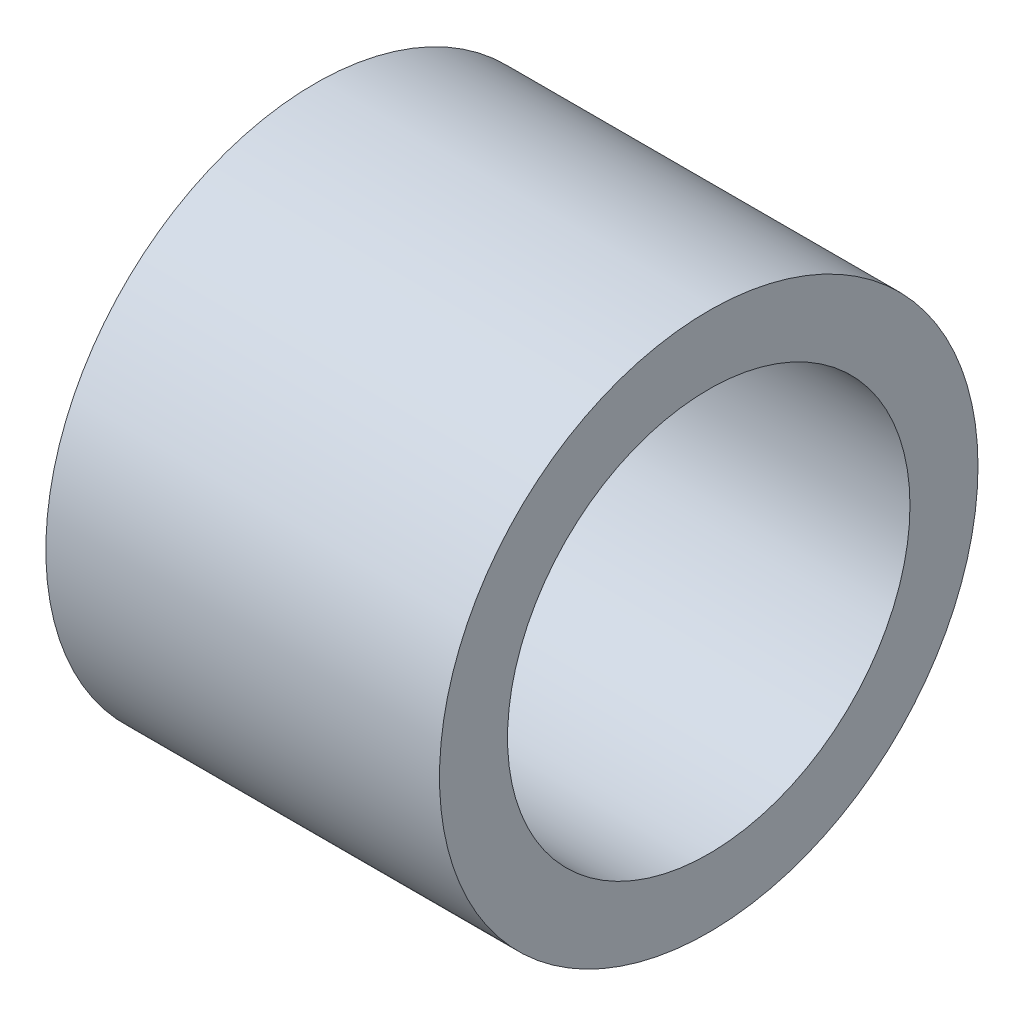
ISO-10303-21;
HEADER;
FILE_DESCRIPTION(('STEP AP214'),'2;1');
FILE_NAME('part.step','',(''),(''),'','','');
FILE_SCHEMA(('AUTOMOTIVE_DESIGN { 1 0 10303 214 1 1 1 1 }'));
ENDSEC;
DATA;
#1=APPLICATION_CONTEXT('core data for automotive mechanical design processes');
#2=APPLICATION_PROTOCOL_DEFINITION('international standard','automotive_design',2000,#1);
#3=PRODUCT_CONTEXT('',#1,'mechanical');
#4=PRODUCT('Part','Part','',(#3));
#5=PRODUCT_RELATED_PRODUCT_CATEGORY('part','',(#4));
#6=PRODUCT_DEFINITION_FORMATION('','',#4);
#7=PRODUCT_DEFINITION_CONTEXT('part definition',#1,'design');
#8=PRODUCT_DEFINITION('design','',#6,#7);
#9=PRODUCT_DEFINITION_SHAPE('','',#8);
#10=(LENGTH_UNIT() NAMED_UNIT(*) SI_UNIT(.MILLI.,.METRE.));
#11=(NAMED_UNIT(*) PLANE_ANGLE_UNIT() SI_UNIT($,.RADIAN.));
#12=(NAMED_UNIT(*) SI_UNIT($,.STERADIAN.) SOLID_ANGLE_UNIT());
#13=UNCERTAINTY_MEASURE_WITH_UNIT(LENGTH_MEASURE(1.E-05),#10,'distance_accuracy_value','');
#14=(GEOMETRIC_REPRESENTATION_CONTEXT(3) GLOBAL_UNCERTAINTY_ASSIGNED_CONTEXT((#13)) GLOBAL_UNIT_ASSIGNED_CONTEXT((#10,
#11,#12)) REPRESENTATION_CONTEXT('',''));
#15=CARTESIAN_POINT('',(0.,0.,0.));
#16=DIRECTION('',(0.,0.,1.));
#17=DIRECTION('',(1.,0.,0.));
#18=AXIS2_PLACEMENT_3D('',#15,#16,#17);
#19=CARTESIAN_POINT('',(0.,0.,0.));
#20=DIRECTION('',(1.,0.,0.));
#21=DIRECTION('',(0.,0.,-1.));
#22=AXIS2_PLACEMENT_3D('',#19,#20,#21);
#23=CYLINDRICAL_SURFACE('',#22,8.1153);
#24=CARTESIAN_POINT('',(15.875,0.,0.));
#25=DIRECTION('',(1.,0.,0.));
#26=DIRECTION('',(0.,0.,-1.));
#27=AXIS2_PLACEMENT_3D('',#24,#25,#26);
#28=CIRCLE('',#27,8.1153);
#29=CARTESIAN_POINT('',(15.875,0.,-8.1153));
#30=VERTEX_POINT('',#29);
#31=EDGE_CURVE('E17',#30,#30,#28,.F.);
#32=ORIENTED_EDGE('',*,*,#31,.F.);
#33=EDGE_LOOP('',(#32));
#34=FACE_BOUND('',#33,.T.);
#35=CARTESIAN_POINT('',(0.,0.,0.));
#36=DIRECTION('',(1.,0.,0.));
#37=DIRECTION('',(0.,0.,-1.));
#38=AXIS2_PLACEMENT_3D('',#35,#36,#37);
#39=CIRCLE('',#38,8.1153);
#40=CARTESIAN_POINT('',(0.,0.,-8.1153));
#41=VERTEX_POINT('',#40);
#42=EDGE_CURVE('E26',#41,#41,#39,.F.);
#43=ORIENTED_EDGE('',*,*,#42,.T.);
#44=EDGE_LOOP('',(#43));
#45=FACE_BOUND('',#44,.T.);
#46=ADVANCED_FACE('F14',(#34,#45),#23,.F.);
#47=CARTESIAN_POINT('',(15.875,0.,0.));
#48=DIRECTION('',(1.,0.,0.));
#49=DIRECTION('',(0.,0.,-1.));
#50=AXIS2_PLACEMENT_3D('',#47,#48,#49);
#51=PLANE('',#50);
#52=ORIENTED_EDGE('',*,*,#31,.T.);
#53=EDGE_LOOP('',(#52));
#54=FACE_BOUND('',#53,.T.);
#55=CARTESIAN_POINT('',(15.875,0.,0.));
#56=DIRECTION('',(1.,0.,0.));
#57=DIRECTION('',(0.,0.,-1.));
#58=AXIS2_PLACEMENT_3D('',#55,#56,#57);
#59=CIRCLE('',#58,10.8585);
#60=CARTESIAN_POINT('',(15.875,0.,-10.8585));
#61=VERTEX_POINT('',#60);
#62=EDGE_CURVE('E21',#61,#61,#59,.F.);
#63=ORIENTED_EDGE('',*,*,#62,.F.);
#64=EDGE_LOOP('',(#63));
#65=FACE_BOUND('',#64,.T.);
#66=ADVANCED_FACE('F34',(#54,#65),#51,.T.);
#67=CARTESIAN_POINT('',(0.,0.,0.));
#68=DIRECTION('',(1.,0.,0.));
#69=DIRECTION('',(0.,0.,-1.));
#70=AXIS2_PLACEMENT_3D('',#67,#68,#69);
#71=PLANE('',#70);
#72=ORIENTED_EDGE('',*,*,#42,.F.);
#73=EDGE_LOOP('',(#72));
#74=FACE_BOUND('',#73,.T.);
#75=CARTESIAN_POINT('',(0.,0.,0.));
#76=DIRECTION('',(1.,0.,0.));
#77=DIRECTION('',(0.,0.,-1.));
#78=AXIS2_PLACEMENT_3D('',#75,#76,#77);
#79=CIRCLE('',#78,10.8585);
#80=CARTESIAN_POINT('',(0.,0.,-10.8585));
#81=VERTEX_POINT('',#80);
#82=EDGE_CURVE('E10',#81,#81,#79,.T.);
#83=ORIENTED_EDGE('',*,*,#82,.F.);
#84=EDGE_LOOP('',(#83));
#85=FACE_BOUND('',#84,.T.);
#86=ADVANCED_FACE('F42',(#74,#85),#71,.F.);
#87=CARTESIAN_POINT('',(0.,0.,0.));
#88=DIRECTION('',(1.,0.,0.));
#89=DIRECTION('',(0.,0.,-1.));
#90=AXIS2_PLACEMENT_3D('',#87,#88,#89);
#91=CYLINDRICAL_SURFACE('',#90,10.8585);
#92=ORIENTED_EDGE('',*,*,#62,.T.);
#93=EDGE_LOOP('',(#92));
#94=FACE_BOUND('',#93,.T.);
#95=ORIENTED_EDGE('',*,*,#82,.T.);
#96=EDGE_LOOP('',(#95));
#97=FACE_BOUND('',#96,.T.);
#98=ADVANCED_FACE('F43',(#94,#97),#91,.T.);
#99=CLOSED_SHELL('',(#46,#66,#86,#98));
#100=MANIFOLD_SOLID_BREP('B1',#99);
#101=ADVANCED_BREP_SHAPE_REPRESENTATION('',(#18,#100),#14);
#102=SHAPE_DEFINITION_REPRESENTATION(#9,#101);
ENDSEC;
END-ISO-10303-21;
